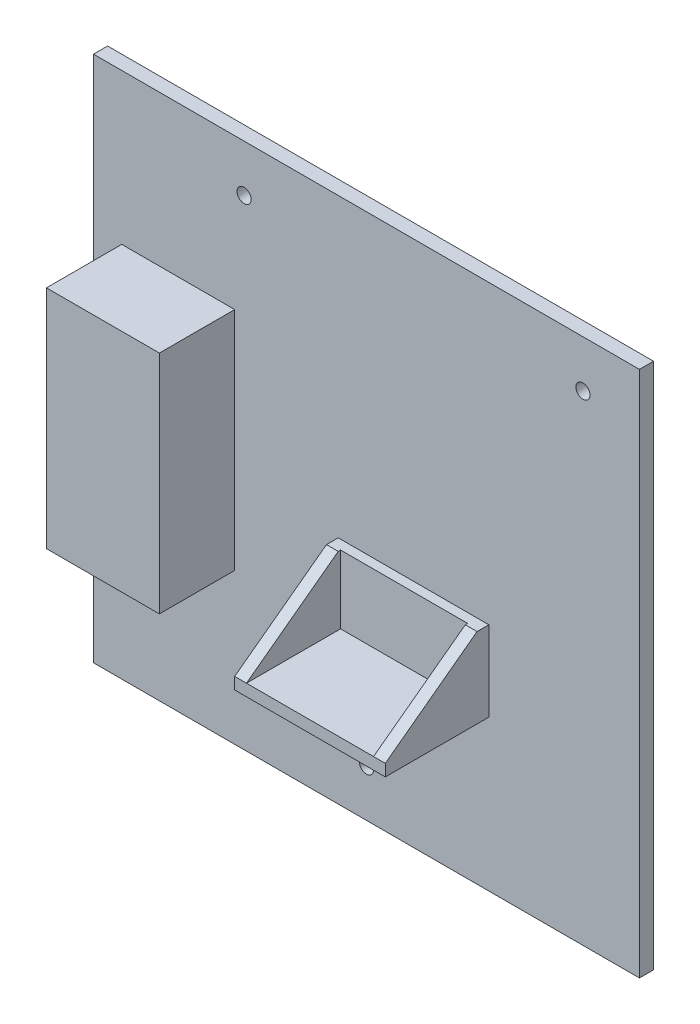
ISO-10303-21;
HEADER;
FILE_DESCRIPTION(('STEP AP214'),'2;1');
FILE_NAME('part.step','',(''),(''),'','','');
FILE_SCHEMA(('AUTOMOTIVE_DESIGN { 1 0 10303 214 1 1 1 1 }'));
ENDSEC;
DATA;
#1=APPLICATION_CONTEXT('core data for automotive mechanical design processes');
#2=APPLICATION_PROTOCOL_DEFINITION('international standard','automotive_design',2000,#1);
#3=PRODUCT_CONTEXT('',#1,'mechanical');
#4=PRODUCT('Part','Part','',(#3));
#5=PRODUCT_RELATED_PRODUCT_CATEGORY('part','',(#4));
#6=PRODUCT_DEFINITION_FORMATION('','',#4);
#7=PRODUCT_DEFINITION_CONTEXT('part definition',#1,'design');
#8=PRODUCT_DEFINITION('design','',#6,#7);
#9=PRODUCT_DEFINITION_SHAPE('','',#8);
#10=(LENGTH_UNIT() NAMED_UNIT(*) SI_UNIT(.MILLI.,.METRE.));
#11=(NAMED_UNIT(*) PLANE_ANGLE_UNIT() SI_UNIT($,.RADIAN.));
#12=(NAMED_UNIT(*) SI_UNIT($,.STERADIAN.) SOLID_ANGLE_UNIT());
#13=UNCERTAINTY_MEASURE_WITH_UNIT(LENGTH_MEASURE(1.E-05),#10,'distance_accuracy_value','');
#14=(GEOMETRIC_REPRESENTATION_CONTEXT(3) GLOBAL_UNCERTAINTY_ASSIGNED_CONTEXT((#13)) GLOBAL_UNIT_ASSIGNED_CONTEXT((#10,
#11,#12)) REPRESENTATION_CONTEXT('',''));
#15=CARTESIAN_POINT('',(0.,0.,0.));
#16=DIRECTION('',(0.,0.,1.));
#17=DIRECTION('',(1.,0.,0.));
#18=AXIS2_PLACEMENT_3D('',#15,#16,#17);
#19=CARTESIAN_POINT('',(-3.50000000000003,-24.,25.));
#20=DIRECTION('',(1.,0.,0.));
#21=DIRECTION('',(0.,0.,-1.));
#22=AXIS2_PLACEMENT_3D('',#19,#20,#21);
#23=PLANE('',#22);
#24=DIRECTION('',(0.,0.596702766344561,-0.802462340946133));
#25=VECTOR('',#24,1.);
#26=CARTESIAN_POINT('',(-3.50000000000003,-22.3901354784081,26.1970787468247));
#27=LINE('',#26,#25);
#28=CARTESIAN_POINT('',(-3.50000000000003,-21.5,25.));
#29=VERTEX_POINT('',#28);
#30=CARTESIAN_POINT('',(-3.50000000000003,-7.00000000000001,5.5));
#31=VERTEX_POINT('',#30);
#32=EDGE_CURVE('E60',#29,#31,#27,.T.);
#33=ORIENTED_EDGE('',*,*,#32,.F.);
#34=DIRECTION('',(0.,0.,-1.));
#35=VECTOR('',#34,1.);
#36=CARTESIAN_POINT('',(-3.50000000000003,-21.5,25.));
#37=LINE('',#36,#35);
#38=CARTESIAN_POINT('',(-3.50000000000003,-21.5,5.));
#39=VERTEX_POINT('',#38);
#40=EDGE_CURVE('E374',#29,#39,#37,.T.);
#41=ORIENTED_EDGE('',*,*,#40,.T.);
#42=DIRECTION('',(0.,-1.,0.));
#43=VECTOR('',#42,1.);
#44=CARTESIAN_POINT('',(-3.50000000000003,-7.00000000000001,5.));
#45=LINE('',#44,#43);
#46=CARTESIAN_POINT('',(-3.50000000000003,-7.00000000000001,5.));
#47=VERTEX_POINT('',#46);
#48=EDGE_CURVE('E362',#47,#39,#45,.T.);
#49=ORIENTED_EDGE('',*,*,#48,.F.);
#50=DIRECTION('',(0.,0.,-1.));
#51=VECTOR('',#50,1.);
#52=CARTESIAN_POINT('',(-3.50000000000003,-7.00000000000001,25.));
#53=LINE('',#52,#51);
#54=EDGE_CURVE('E391',#31,#47,#53,.T.);
#55=ORIENTED_EDGE('',*,*,#54,.F.);
#56=EDGE_LOOP('',(#33,#41,#49,#55));
#57=FACE_BOUND('',#56,.T.);
#58=ADVANCED_FACE('F35',(#57),#23,.T.);
#59=CARTESIAN_POINT('',(23.5,-7.00000000000001,25.));
#60=DIRECTION('',(-1.,0.,0.));
#61=DIRECTION('',(0.,0.,1.));
#62=AXIS2_PLACEMENT_3D('',#59,#60,#61);
#63=PLANE('',#62);
#64=DIRECTION('',(0.,-0.596702766344561,0.802462340946133));
#65=VECTOR('',#64,1.);
#66=CARTESIAN_POINT('',(23.5,-16.3372142252329,18.0569432684166));
#67=LINE('',#66,#65);
#68=CARTESIAN_POINT('',(23.5,-7.00000000000001,5.5));
#69=VERTEX_POINT('',#68);
#70=CARTESIAN_POINT('',(23.5,-21.5,25.));
#71=VERTEX_POINT('',#70);
#72=EDGE_CURVE('E180',#69,#71,#67,.T.);
#73=ORIENTED_EDGE('',*,*,#72,.F.);
#74=DIRECTION('',(0.,0.,-1.));
#75=VECTOR('',#74,1.);
#76=CARTESIAN_POINT('',(23.5,-7.00000000000001,25.));
#77=LINE('',#76,#75);
#78=CARTESIAN_POINT('',(23.5,-7.00000000000001,5.));
#79=VERTEX_POINT('',#78);
#80=EDGE_CURVE('E345',#69,#79,#77,.T.);
#81=ORIENTED_EDGE('',*,*,#80,.T.);
#82=DIRECTION('',(0.,-1.,0.));
#83=VECTOR('',#82,1.);
#84=CARTESIAN_POINT('',(23.5,-7.00000000000001,5.));
#85=LINE('',#84,#83);
#86=CARTESIAN_POINT('',(23.5,-21.5,5.));
#87=VERTEX_POINT('',#86);
#88=EDGE_CURVE('E359',#79,#87,#85,.T.);
#89=ORIENTED_EDGE('',*,*,#88,.T.);
#90=DIRECTION('',(0.,0.,-1.));
#91=VECTOR('',#90,1.);
#92=CARTESIAN_POINT('',(23.5,-21.5,25.));
#93=LINE('',#92,#91);
#94=EDGE_CURVE('E350',#71,#87,#93,.T.);
#95=ORIENTED_EDGE('',*,*,#94,.F.);
#96=EDGE_LOOP('',(#73,#81,#89,#95));
#97=FACE_BOUND('',#96,.T.);
#98=ADVANCED_FACE('F347',(#97),#63,.T.);
#99=CARTESIAN_POINT('',(-6.00000000000003,-21.5,25.));
#100=DIRECTION('',(0.,1.,0.));
#101=DIRECTION('',(0.,0.,1.));
#102=AXIS2_PLACEMENT_3D('',#99,#100,#101);
#103=PLANE('',#102);
#104=ORIENTED_EDGE('',*,*,#94,.T.);
#105=DIRECTION('',(1.,0.,0.));
#106=VECTOR('',#105,1.);
#107=CARTESIAN_POINT('',(23.5,-21.5,5.));
#108=LINE('',#107,#106);
#109=EDGE_CURVE('E353',#39,#87,#108,.T.);
#110=ORIENTED_EDGE('',*,*,#109,.F.);
#111=ORIENTED_EDGE('',*,*,#40,.F.);
#112=DIRECTION('',(1.,0.,0.));
#113=VECTOR('',#112,1.);
#114=CARTESIAN_POINT('',(0.,-21.5,25.));
#115=LINE('',#114,#113);
#116=EDGE_CURVE('E364',#29,#71,#115,.T.);
#117=ORIENTED_EDGE('',*,*,#116,.T.);
#118=EDGE_LOOP('',(#104,#110,#111,#117));
#119=FACE_BOUND('',#118,.T.);
#120=ADVANCED_FACE('F421',(#119),#103,.T.);
#121=CARTESIAN_POINT('',(0.,0.,25.));
#122=DIRECTION('',(0.,0.,-1.));
#123=DIRECTION('',(-1.,0.,0.));
#124=AXIS2_PLACEMENT_3D('',#121,#122,#123);
#125=PLANE('',#124);
#126=DIRECTION('',(0.,1.,0.));
#127=VECTOR('',#126,1.);
#128=CARTESIAN_POINT('',(26.,-7.00000000000001,25.));
#129=LINE('',#128,#127);
#130=CARTESIAN_POINT('',(26.,-24.,25.));
#131=VERTEX_POINT('',#130);
#132=CARTESIAN_POINT('',(26.,-21.5,25.));
#133=VERTEX_POINT('',#132);
#134=EDGE_CURVE('E192',#131,#133,#129,.T.);
#135=ORIENTED_EDGE('',*,*,#134,.T.);
#136=DIRECTION('',(1.,0.,0.));
#137=VECTOR('',#136,1.);
#138=CARTESIAN_POINT('',(-8.50000000000004,-21.5,25.));
#139=LINE('',#138,#137);
#140=EDGE_CURVE('E177',#71,#133,#139,.T.);
#141=ORIENTED_EDGE('',*,*,#140,.F.);
#142=ORIENTED_EDGE('',*,*,#116,.F.);
#143=CARTESIAN_POINT('',(-6.00000000000003,-21.5,25.));
#144=VERTEX_POINT('',#143);
#145=EDGE_CURVE('E185',#144,#29,#139,.T.);
#146=ORIENTED_EDGE('',*,*,#145,.F.);
#147=DIRECTION('',(0.,-1.,0.));
#148=VECTOR('',#147,1.);
#149=CARTESIAN_POINT('',(-6.00000000000003,-24.,25.));
#150=LINE('',#149,#148);
#151=CARTESIAN_POINT('',(-6.00000000000003,-24.,25.));
#152=VERTEX_POINT('',#151);
#153=EDGE_CURVE('E203',#144,#152,#150,.T.);
#154=ORIENTED_EDGE('',*,*,#153,.T.);
#155=DIRECTION('',(1.,0.,0.));
#156=VECTOR('',#155,1.);
#157=CARTESIAN_POINT('',(-6.00000000000003,-24.,25.));
#158=LINE('',#157,#156);
#159=EDGE_CURVE('E198',#152,#131,#158,.T.);
#160=ORIENTED_EDGE('',*,*,#159,.T.);
#161=EDGE_LOOP('',(#135,#141,#142,#146,#154,#160));
#162=FACE_BOUND('',#161,.T.);
#163=ADVANCED_FACE('F196',(#162),#125,.F.);
#164=CARTESIAN_POINT('',(0.,0.,3.));
#165=DIRECTION('',(0.,0.,-1.));
#166=DIRECTION('',(-1.,0.,0.));
#167=AXIS2_PLACEMENT_3D('',#164,#165,#166);
#168=PLANE('',#167);
#169=CARTESIAN_POINT('',(-26.,46.,3.));
#170=DIRECTION('',(0.,0.,1.));
#171=DIRECTION('',(1.,0.,0.));
#172=AXIS2_PLACEMENT_3D('',#169,#170,#171);
#173=CIRCLE('',#172,1.5);
#174=CARTESIAN_POINT('',(-24.5,46.,3.));
#175=VERTEX_POINT('',#174);
#176=EDGE_CURVE('E291',#175,#175,#173,.T.);
#177=ORIENTED_EDGE('',*,*,#176,.F.);
#178=EDGE_LOOP('',(#177));
#179=FACE_BOUND('',#178,.T.);
#180=CARTESIAN_POINT('',(46.,46.,3.));
#181=DIRECTION('',(0.,0.,1.));
#182=DIRECTION('',(1.,0.,0.));
#183=AXIS2_PLACEMENT_3D('',#180,#181,#182);
#184=CIRCLE('',#183,1.5);
#185=CARTESIAN_POINT('',(47.5,46.,3.));
#186=VERTEX_POINT('',#185);
#187=EDGE_CURVE('E667',#186,#186,#184,.T.);
#188=ORIENTED_EDGE('',*,*,#187,.F.);
#189=EDGE_LOOP('',(#188));
#190=FACE_BOUND('',#189,.T.);
#191=CARTESIAN_POINT('',(0.,-46.,3.));
#192=DIRECTION('',(0.,0.,1.));
#193=DIRECTION('',(1.,0.,0.));
#194=AXIS2_PLACEMENT_3D('',#191,#192,#193);
#195=CIRCLE('',#194,1.5);
#196=CARTESIAN_POINT('',(1.49999999999997,-46.,3.));
#197=VERTEX_POINT('',#196);
#198=EDGE_CURVE('E669',#197,#197,#195,.T.);
#199=ORIENTED_EDGE('',*,*,#198,.F.);
#200=EDGE_LOOP('',(#199));
#201=FACE_BOUND('',#200,.T.);
#202=DIRECTION('',(0.,1.,0.));
#203=VECTOR('',#202,1.);
#204=CARTESIAN_POINT('',(-28.,-24.,3.));
#205=LINE('',#204,#203);
#206=CARTESIAN_POINT('',(-28.,-24.,3.));
#207=VERTEX_POINT('',#206);
#208=CARTESIAN_POINT('',(-28.,24.,3.));
#209=VERTEX_POINT('',#208);
#210=EDGE_CURVE('E225',#207,#209,#205,.T.);
#211=ORIENTED_EDGE('',*,*,#210,.F.);
#212=DIRECTION('',(1.,0.,0.));
#213=VECTOR('',#212,1.);
#214=CARTESIAN_POINT('',(-52.,-24.,3.));
#215=LINE('',#214,#213);
#216=CARTESIAN_POINT('',(-52.,-24.,3.));
#217=VERTEX_POINT('',#216);
#218=EDGE_CURVE('E230',#217,#207,#215,.T.);
#219=ORIENTED_EDGE('',*,*,#218,.F.);
#220=DIRECTION('',(0.,-1.,0.));
#221=VECTOR('',#220,1.);
#222=CARTESIAN_POINT('',(-52.,-24.,3.));
#223=LINE('',#222,#221);
#224=CARTESIAN_POINT('',(-52.,24.,3.));
#225=VERTEX_POINT('',#224);
#226=EDGE_CURVE('E242',#225,#217,#223,.T.);
#227=ORIENTED_EDGE('',*,*,#226,.F.);
#228=DIRECTION('',(-1.,0.,0.));
#229=VECTOR('',#228,1.);
#230=CARTESIAN_POINT('',(-52.,24.,3.));
#231=LINE('',#230,#229);
#232=EDGE_CURVE('E239',#209,#225,#231,.T.);
#233=ORIENTED_EDGE('',*,*,#232,.F.);
#234=EDGE_LOOP('',(#211,#219,#227,#233));
#235=FACE_BOUND('',#234,.T.);
#236=DIRECTION('',(0.,1.,0.));
#237=VECTOR('',#236,1.);
#238=CARTESIAN_POINT('',(58.,-56.,3.));
#239=LINE('',#238,#237);
#240=CARTESIAN_POINT('',(58.,-56.,3.));
#241=VERTEX_POINT('',#240);
#242=CARTESIAN_POINT('',(58.,56.,3.));
#243=VERTEX_POINT('',#242);
#244=EDGE_CURVE('E259',#241,#243,#239,.T.);
#245=ORIENTED_EDGE('',*,*,#244,.T.);
#246=DIRECTION('',(-1.,0.,0.));
#247=VECTOR('',#246,1.);
#248=CARTESIAN_POINT('',(-58.,56.,3.));
#249=LINE('',#248,#247);
#250=CARTESIAN_POINT('',(-58.,56.,3.));
#251=VERTEX_POINT('',#250);
#252=EDGE_CURVE('E262',#243,#251,#249,.T.);
#253=ORIENTED_EDGE('',*,*,#252,.T.);
#254=DIRECTION('',(0.,-1.,0.));
#255=VECTOR('',#254,1.);
#256=CARTESIAN_POINT('',(-58.,-56.,3.));
#257=LINE('',#256,#255);
#258=CARTESIAN_POINT('',(-58.,-56.,3.));
#259=VERTEX_POINT('',#258);
#260=EDGE_CURVE('E265',#251,#259,#257,.T.);
#261=ORIENTED_EDGE('',*,*,#260,.T.);
#262=DIRECTION('',(1.,0.,0.));
#263=VECTOR('',#262,1.);
#264=CARTESIAN_POINT('',(-58.,-56.,3.));
#265=LINE('',#264,#263);
#266=EDGE_CURVE('E267',#259,#241,#265,.T.);
#267=ORIENTED_EDGE('',*,*,#266,.T.);
#268=EDGE_LOOP('',(#245,#253,#261,#267));
#269=FACE_BOUND('',#268,.T.);
#270=DIRECTION('',(0.,-1.,0.));
#271=VECTOR('',#270,1.);
#272=CARTESIAN_POINT('',(-6.00000000000003,-24.,3.));
#273=LINE('',#272,#271);
#274=CARTESIAN_POINT('',(-6.00000000000003,-7.00000000000001,3.));
#275=VERTEX_POINT('',#274);
#276=CARTESIAN_POINT('',(-6.00000000000003,-24.,3.));
#277=VERTEX_POINT('',#276);
#278=EDGE_CURVE('E207',#275,#277,#273,.T.);
#279=ORIENTED_EDGE('',*,*,#278,.F.);
#280=DIRECTION('',(-1.,0.,0.));
#281=VECTOR('',#280,1.);
#282=CARTESIAN_POINT('',(-6.00000000000003,-7.00000000000001,3.));
#283=LINE('',#282,#281);
#284=CARTESIAN_POINT('',(26.,-7.00000000000001,3.));
#285=VERTEX_POINT('',#284);
#286=EDGE_CURVE('E216',#285,#275,#283,.T.);
#287=ORIENTED_EDGE('',*,*,#286,.F.);
#288=DIRECTION('',(0.,1.,0.));
#289=VECTOR('',#288,1.);
#290=CARTESIAN_POINT('',(26.,-7.00000000000001,3.));
#291=LINE('',#290,#289);
#292=CARTESIAN_POINT('',(26.,-24.,3.));
#293=VERTEX_POINT('',#292);
#294=EDGE_CURVE('E214',#293,#285,#291,.T.);
#295=ORIENTED_EDGE('',*,*,#294,.F.);
#296=DIRECTION('',(1.,0.,0.));
#297=VECTOR('',#296,1.);
#298=CARTESIAN_POINT('',(-6.00000000000003,-24.,3.));
#299=LINE('',#298,#297);
#300=EDGE_CURVE('E210',#277,#293,#299,.T.);
#301=ORIENTED_EDGE('',*,*,#300,.F.);
#302=EDGE_LOOP('',(#279,#287,#295,#301));
#303=FACE_BOUND('',#302,.T.);
#304=ADVANCED_FACE('F327',(#179,#190,#201,#235,#269,#303),#168,.F.);
#305=CARTESIAN_POINT('',(58.,-56.,3.));
#306=DIRECTION('',(-1.,0.,0.));
#307=DIRECTION('',(0.,0.,1.));
#308=AXIS2_PLACEMENT_3D('',#305,#306,#307);
#309=PLANE('',#308);
#310=DIRECTION('',(0.,1.,0.));
#311=VECTOR('',#310,1.);
#312=CARTESIAN_POINT('',(58.,-56.,0.));
#313=LINE('',#312,#311);
#314=CARTESIAN_POINT('',(58.,-56.,0.));
#315=VERTEX_POINT('',#314);
#316=CARTESIAN_POINT('',(58.,56.,0.));
#317=VERTEX_POINT('',#316);
#318=EDGE_CURVE('E258',#315,#317,#313,.T.);
#319=ORIENTED_EDGE('',*,*,#318,.T.);
#320=DIRECTION('',(0.,0.,-1.));
#321=VECTOR('',#320,1.);
#322=CARTESIAN_POINT('',(58.,56.,3.));
#323=LINE('',#322,#321);
#324=EDGE_CURVE('E285',#243,#317,#323,.T.);
#325=ORIENTED_EDGE('',*,*,#324,.F.);
#326=ORIENTED_EDGE('',*,*,#244,.F.);
#327=DIRECTION('',(0.,0.,-1.));
#328=VECTOR('',#327,1.);
#329=CARTESIAN_POINT('',(58.,-56.,3.));
#330=LINE('',#329,#328);
#331=EDGE_CURVE('E269',#241,#315,#330,.T.);
#332=ORIENTED_EDGE('',*,*,#331,.T.);
#333=EDGE_LOOP('',(#319,#325,#326,#332));
#334=FACE_BOUND('',#333,.T.);
#335=ADVANCED_FACE('F37',(#334),#309,.F.);
#336=CARTESIAN_POINT('',(-58.,56.,3.));
#337=DIRECTION('',(0.,-1.,0.));
#338=DIRECTION('',(0.,0.,-1.));
#339=AXIS2_PLACEMENT_3D('',#336,#337,#338);
#340=PLANE('',#339);
#341=DIRECTION('',(-1.,0.,0.));
#342=VECTOR('',#341,1.);
#343=CARTESIAN_POINT('',(-58.,56.,0.));
#344=LINE('',#343,#342);
#345=CARTESIAN_POINT('',(-58.,56.,0.));
#346=VERTEX_POINT('',#345);
#347=EDGE_CURVE('E272',#317,#346,#344,.T.);
#348=ORIENTED_EDGE('',*,*,#347,.T.);
#349=DIRECTION('',(0.,0.,-1.));
#350=VECTOR('',#349,1.);
#351=CARTESIAN_POINT('',(-58.,56.,3.));
#352=LINE('',#351,#350);
#353=EDGE_CURVE('E282',#251,#346,#352,.T.);
#354=ORIENTED_EDGE('',*,*,#353,.F.);
#355=ORIENTED_EDGE('',*,*,#252,.F.);
#356=ORIENTED_EDGE('',*,*,#324,.T.);
#357=EDGE_LOOP('',(#348,#354,#355,#356));
#358=FACE_BOUND('',#357,.T.);
#359=ADVANCED_FACE('F325',(#358),#340,.F.);
#360=CARTESIAN_POINT('',(-58.,-56.,3.));
#361=DIRECTION('',(1.,0.,0.));
#362=DIRECTION('',(0.,0.,-1.));
#363=AXIS2_PLACEMENT_3D('',#360,#361,#362);
#364=PLANE('',#363);
#365=DIRECTION('',(0.,-1.,0.));
#366=VECTOR('',#365,1.);
#367=CARTESIAN_POINT('',(-58.,-56.,0.));
#368=LINE('',#367,#366);
#369=CARTESIAN_POINT('',(-58.,-56.,0.));
#370=VERTEX_POINT('',#369);
#371=EDGE_CURVE('E274',#346,#370,#368,.T.);
#372=ORIENTED_EDGE('',*,*,#371,.T.);
#373=DIRECTION('',(0.,0.,-1.));
#374=VECTOR('',#373,1.);
#375=CARTESIAN_POINT('',(-58.,-56.,3.));
#376=LINE('',#375,#374);
#377=EDGE_CURVE('E279',#259,#370,#376,.T.);
#378=ORIENTED_EDGE('',*,*,#377,.F.);
#379=ORIENTED_EDGE('',*,*,#260,.F.);
#380=ORIENTED_EDGE('',*,*,#353,.T.);
#381=EDGE_LOOP('',(#372,#378,#379,#380));
#382=FACE_BOUND('',#381,.T.);
#383=ADVANCED_FACE('F322',(#382),#364,.F.);
#384=CARTESIAN_POINT('',(-58.,-56.,3.));
#385=DIRECTION('',(0.,1.,0.));
#386=DIRECTION('',(0.,0.,1.));
#387=AXIS2_PLACEMENT_3D('',#384,#385,#386);
#388=PLANE('',#387);
#389=DIRECTION('',(1.,0.,0.));
#390=VECTOR('',#389,1.);
#391=CARTESIAN_POINT('',(-58.,-56.,0.));
#392=LINE('',#391,#390);
#393=EDGE_CURVE('E263',#370,#315,#392,.T.);
#394=ORIENTED_EDGE('',*,*,#393,.T.);
#395=ORIENTED_EDGE('',*,*,#331,.F.);
#396=ORIENTED_EDGE('',*,*,#266,.F.);
#397=ORIENTED_EDGE('',*,*,#377,.T.);
#398=EDGE_LOOP('',(#394,#395,#396,#397));
#399=FACE_BOUND('',#398,.T.);
#400=ADVANCED_FACE('F305',(#399),#388,.F.);
#401=CARTESIAN_POINT('',(0.,0.,0.));
#402=DIRECTION('',(0.,0.,-1.));
#403=DIRECTION('',(-1.,0.,0.));
#404=AXIS2_PLACEMENT_3D('',#401,#402,#403);
#405=PLANE('',#404);
#406=CARTESIAN_POINT('',(-26.,46.,0.));
#407=DIRECTION('',(0.,0.,-1.));
#408=DIRECTION('',(-1.,0.,0.));
#409=AXIS2_PLACEMENT_3D('',#406,#407,#408);
#410=CIRCLE('',#409,1.5);
#411=CARTESIAN_POINT('',(-27.5,46.,0.));
#412=VERTEX_POINT('',#411);
#413=EDGE_CURVE('E39',#412,#412,#410,.T.);
#414=ORIENTED_EDGE('',*,*,#413,.F.);
#415=EDGE_LOOP('',(#414));
#416=FACE_BOUND('',#415,.T.);
#417=CARTESIAN_POINT('',(46.,46.,0.));
#418=DIRECTION('',(0.,0.,-1.));
#419=DIRECTION('',(-1.,0.,0.));
#420=AXIS2_PLACEMENT_3D('',#417,#418,#419);
#421=CIRCLE('',#420,1.5);
#422=CARTESIAN_POINT('',(44.5,46.,0.));
#423=VERTEX_POINT('',#422);
#424=EDGE_CURVE('E290',#423,#423,#421,.T.);
#425=ORIENTED_EDGE('',*,*,#424,.F.);
#426=EDGE_LOOP('',(#425));
#427=FACE_BOUND('',#426,.T.);
#428=CARTESIAN_POINT('',(0.,-46.,0.));
#429=DIRECTION('',(0.,0.,-1.));
#430=DIRECTION('',(-1.,0.,0.));
#431=AXIS2_PLACEMENT_3D('',#428,#429,#430);
#432=CIRCLE('',#431,1.5);
#433=CARTESIAN_POINT('',(-1.50000000000003,-46.,0.));
#434=VERTEX_POINT('',#433);
#435=EDGE_CURVE('E288',#434,#434,#432,.T.);
#436=ORIENTED_EDGE('',*,*,#435,.F.);
#437=EDGE_LOOP('',(#436));
#438=FACE_BOUND('',#437,.T.);
#439=ORIENTED_EDGE('',*,*,#318,.F.);
#440=ORIENTED_EDGE('',*,*,#393,.F.);
#441=ORIENTED_EDGE('',*,*,#371,.F.);
#442=ORIENTED_EDGE('',*,*,#347,.F.);
#443=EDGE_LOOP('',(#439,#440,#441,#442));
#444=FACE_BOUND('',#443,.T.);
#445=ADVANCED_FACE('F301',(#416,#427,#438,#444),#405,.T.);
#446=CARTESIAN_POINT('',(-28.,-24.,19.));
#447=DIRECTION('',(-1.,0.,0.));
#448=DIRECTION('',(0.,0.,1.));
#449=AXIS2_PLACEMENT_3D('',#446,#447,#448);
#450=PLANE('',#449);
#451=ORIENTED_EDGE('',*,*,#210,.T.);
#452=DIRECTION('',(0.,0.,-1.));
#453=VECTOR('',#452,1.);
#454=CARTESIAN_POINT('',(-28.,24.,19.));
#455=LINE('',#454,#453);
#456=CARTESIAN_POINT('',(-28.,24.,19.));
#457=VERTEX_POINT('',#456);
#458=EDGE_CURVE('E255',#457,#209,#455,.T.);
#459=ORIENTED_EDGE('',*,*,#458,.F.);
#460=DIRECTION('',(0.,1.,0.));
#461=VECTOR('',#460,1.);
#462=CARTESIAN_POINT('',(-28.,-24.,19.));
#463=LINE('',#462,#461);
#464=CARTESIAN_POINT('',(-28.,-24.,19.));
#465=VERTEX_POINT('',#464);
#466=EDGE_CURVE('E226',#465,#457,#463,.T.);
#467=ORIENTED_EDGE('',*,*,#466,.F.);
#468=DIRECTION('',(0.,0.,-1.));
#469=VECTOR('',#468,1.);
#470=CARTESIAN_POINT('',(-28.,-24.,19.));
#471=LINE('',#470,#469);
#472=EDGE_CURVE('E236',#465,#207,#471,.T.);
#473=ORIENTED_EDGE('',*,*,#472,.T.);
#474=EDGE_LOOP('',(#451,#459,#467,#473));
#475=FACE_BOUND('',#474,.T.);
#476=ADVANCED_FACE('F304',(#475),#450,.F.);
#477=CARTESIAN_POINT('',(-52.,24.,19.));
#478=DIRECTION('',(0.,-1.,0.));
#479=DIRECTION('',(0.,0.,-1.));
#480=AXIS2_PLACEMENT_3D('',#477,#478,#479);
#481=PLANE('',#480);
#482=ORIENTED_EDGE('',*,*,#232,.T.);
#483=DIRECTION('',(0.,0.,-1.));
#484=VECTOR('',#483,1.);
#485=CARTESIAN_POINT('',(-52.,24.,19.));
#486=LINE('',#485,#484);
#487=CARTESIAN_POINT('',(-52.,24.,19.));
#488=VERTEX_POINT('',#487);
#489=EDGE_CURVE('E252',#488,#225,#486,.T.);
#490=ORIENTED_EDGE('',*,*,#489,.F.);
#491=DIRECTION('',(-1.,0.,0.));
#492=VECTOR('',#491,1.);
#493=CARTESIAN_POINT('',(-52.,24.,19.));
#494=LINE('',#493,#492);
#495=EDGE_CURVE('E229',#457,#488,#494,.T.);
#496=ORIENTED_EDGE('',*,*,#495,.F.);
#497=ORIENTED_EDGE('',*,*,#458,.T.);
#498=EDGE_LOOP('',(#482,#490,#496,#497));
#499=FACE_BOUND('',#498,.T.);
#500=ADVANCED_FACE('F541',(#499),#481,.F.);
#501=CARTESIAN_POINT('',(-52.,-24.,19.));
#502=DIRECTION('',(1.,0.,0.));
#503=DIRECTION('',(0.,0.,-1.));
#504=AXIS2_PLACEMENT_3D('',#501,#502,#503);
#505=PLANE('',#504);
#506=ORIENTED_EDGE('',*,*,#226,.T.);
#507=DIRECTION('',(0.,0.,-1.));
#508=VECTOR('',#507,1.);
#509=CARTESIAN_POINT('',(-52.,-24.,19.));
#510=LINE('',#509,#508);
#511=CARTESIAN_POINT('',(-52.,-24.,19.));
#512=VERTEX_POINT('',#511);
#513=EDGE_CURVE('E249',#512,#217,#510,.T.);
#514=ORIENTED_EDGE('',*,*,#513,.F.);
#515=DIRECTION('',(0.,-1.,0.));
#516=VECTOR('',#515,1.);
#517=CARTESIAN_POINT('',(-52.,-24.,19.));
#518=LINE('',#517,#516);
#519=EDGE_CURVE('E232',#488,#512,#518,.T.);
#520=ORIENTED_EDGE('',*,*,#519,.F.);
#521=ORIENTED_EDGE('',*,*,#489,.T.);
#522=EDGE_LOOP('',(#506,#514,#520,#521));
#523=FACE_BOUND('',#522,.T.);
#524=ADVANCED_FACE('F531',(#523),#505,.F.);
#525=CARTESIAN_POINT('',(-52.,-24.,19.));
#526=DIRECTION('',(0.,1.,0.));
#527=DIRECTION('',(0.,0.,1.));
#528=AXIS2_PLACEMENT_3D('',#525,#526,#527);
#529=PLANE('',#528);
#530=ORIENTED_EDGE('',*,*,#218,.T.);
#531=ORIENTED_EDGE('',*,*,#472,.F.);
#532=DIRECTION('',(1.,0.,0.));
#533=VECTOR('',#532,1.);
#534=CARTESIAN_POINT('',(-52.,-24.,19.));
#535=LINE('',#534,#533);
#536=EDGE_CURVE('E234',#512,#465,#535,.T.);
#537=ORIENTED_EDGE('',*,*,#536,.F.);
#538=ORIENTED_EDGE('',*,*,#513,.T.);
#539=EDGE_LOOP('',(#530,#531,#537,#538));
#540=FACE_BOUND('',#539,.T.);
#541=ADVANCED_FACE('F520',(#540),#529,.F.);
#542=CARTESIAN_POINT('',(0.,0.,19.));
#543=DIRECTION('',(0.,0.,-1.));
#544=DIRECTION('',(-1.,0.,0.));
#545=AXIS2_PLACEMENT_3D('',#542,#543,#544);
#546=PLANE('',#545);
#547=ORIENTED_EDGE('',*,*,#466,.T.);
#548=ORIENTED_EDGE('',*,*,#495,.T.);
#549=ORIENTED_EDGE('',*,*,#519,.T.);
#550=ORIENTED_EDGE('',*,*,#536,.T.);
#551=EDGE_LOOP('',(#547,#548,#549,#550));
#552=FACE_BOUND('',#551,.T.);
#553=ADVANCED_FACE('F413',(#552),#546,.F.);
#554=CARTESIAN_POINT('',(-6.00000000000003,-24.,25.));
#555=DIRECTION('',(1.,0.,0.));
#556=DIRECTION('',(0.,0.,-1.));
#557=AXIS2_PLACEMENT_3D('',#554,#555,#556);
#558=PLANE('',#557);
#559=ORIENTED_EDGE('',*,*,#153,.F.);
#560=DIRECTION('',(0.,0.596702766344561,-0.802462340946133));
#561=VECTOR('',#560,1.);
#562=CARTESIAN_POINT('',(-6.00000000000003,-22.3901354784081,26.1970787468247));
#563=LINE('',#562,#561);
#564=CARTESIAN_POINT('',(-6.00000000000003,-7.00000000000001,5.5));
#565=VERTEX_POINT('',#564);
#566=EDGE_CURVE('E340',#144,#565,#563,.T.);
#567=ORIENTED_EDGE('',*,*,#566,.T.);
#568=DIRECTION('',(0.,0.,-1.));
#569=VECTOR('',#568,1.);
#570=CARTESIAN_POINT('',(-6.00000000000003,-7.00000000000001,25.));
#571=LINE('',#570,#569);
#572=EDGE_CURVE('E200',#565,#275,#571,.T.);
#573=ORIENTED_EDGE('',*,*,#572,.T.);
#574=ORIENTED_EDGE('',*,*,#278,.T.);
#575=DIRECTION('',(0.,0.,-1.));
#576=VECTOR('',#575,1.);
#577=CARTESIAN_POINT('',(-6.00000000000003,-24.,25.));
#578=LINE('',#577,#576);
#579=EDGE_CURVE('E222',#152,#277,#578,.T.);
#580=ORIENTED_EDGE('',*,*,#579,.F.);
#581=EDGE_LOOP('',(#559,#567,#573,#574,#580));
#582=FACE_BOUND('',#581,.T.);
#583=ADVANCED_FACE('F337',(#582),#558,.F.);
#584=CARTESIAN_POINT('',(-6.00000000000003,-24.,25.));
#585=DIRECTION('',(0.,1.,0.));
#586=DIRECTION('',(0.,0.,1.));
#587=AXIS2_PLACEMENT_3D('',#584,#585,#586);
#588=PLANE('',#587);
#589=ORIENTED_EDGE('',*,*,#300,.T.);
#590=DIRECTION('',(0.,0.,-1.));
#591=VECTOR('',#590,1.);
#592=CARTESIAN_POINT('',(26.,-24.,25.));
#593=LINE('',#592,#591);
#594=EDGE_CURVE('E220',#131,#293,#593,.T.);
#595=ORIENTED_EDGE('',*,*,#594,.F.);
#596=ORIENTED_EDGE('',*,*,#159,.F.);
#597=ORIENTED_EDGE('',*,*,#579,.T.);
#598=EDGE_LOOP('',(#589,#595,#596,#597));
#599=FACE_BOUND('',#598,.T.);
#600=ADVANCED_FACE('F405',(#599),#588,.F.);
#601=CARTESIAN_POINT('',(26.,-7.00000000000001,25.));
#602=DIRECTION('',(-1.,0.,0.));
#603=DIRECTION('',(0.,0.,1.));
#604=AXIS2_PLACEMENT_3D('',#601,#602,#603);
#605=PLANE('',#604);
#606=DIRECTION('',(0.,0.,-1.));
#607=VECTOR('',#606,1.);
#608=CARTESIAN_POINT('',(26.,-7.00000000000001,25.));
#609=LINE('',#608,#607);
#610=CARTESIAN_POINT('',(26.,-7.00000000000001,5.5));
#611=VERTEX_POINT('',#610);
#612=EDGE_CURVE('E194',#611,#285,#609,.T.);
#613=ORIENTED_EDGE('',*,*,#612,.F.);
#614=DIRECTION('',(0.,0.596702766344561,-0.802462340946133));
#615=VECTOR('',#614,1.);
#616=CARTESIAN_POINT('',(26.,-1.87404741744285,-1.39352243861135));
#617=LINE('',#616,#615);
#618=EDGE_CURVE('E52',#133,#611,#617,.T.);
#619=ORIENTED_EDGE('',*,*,#618,.F.);
#620=ORIENTED_EDGE('',*,*,#134,.F.);
#621=ORIENTED_EDGE('',*,*,#594,.T.);
#622=ORIENTED_EDGE('',*,*,#294,.T.);
#623=EDGE_LOOP('',(#613,#619,#620,#621,#622));
#624=FACE_BOUND('',#623,.T.);
#625=ADVANCED_FACE('F190',(#624),#605,.F.);
#626=CARTESIAN_POINT('',(-6.00000000000003,-7.00000000000001,25.));
#627=DIRECTION('',(0.,-1.,0.));
#628=DIRECTION('',(0.,0.,-1.));
#629=AXIS2_PLACEMENT_3D('',#626,#627,#628);
#630=PLANE('',#629);
#631=ORIENTED_EDGE('',*,*,#572,.F.);
#632=DIRECTION('',(1.,0.,0.));
#633=VECTOR('',#632,1.);
#634=CARTESIAN_POINT('',(-6.00000000000003,-7.00000000000001,5.5));
#635=LINE('',#634,#633);
#636=EDGE_CURVE('E11',#565,#31,#635,.T.);
#637=ORIENTED_EDGE('',*,*,#636,.T.);
#638=ORIENTED_EDGE('',*,*,#54,.T.);
#639=DIRECTION('',(1.,0.,0.));
#640=VECTOR('',#639,1.);
#641=CARTESIAN_POINT('',(23.5,-7.00000000000001,5.));
#642=LINE('',#641,#640);
#643=EDGE_CURVE('E357',#47,#79,#642,.T.);
#644=ORIENTED_EDGE('',*,*,#643,.T.);
#645=ORIENTED_EDGE('',*,*,#80,.F.);
#646=EDGE_CURVE('E44',#69,#611,#635,.T.);
#647=ORIENTED_EDGE('',*,*,#646,.T.);
#648=ORIENTED_EDGE('',*,*,#612,.T.);
#649=ORIENTED_EDGE('',*,*,#286,.T.);
#650=EDGE_LOOP('',(#631,#637,#638,#644,#645,#647,#648,#649));
#651=FACE_BOUND('',#650,.T.);
#652=ADVANCED_FACE('F342',(#651),#630,.F.);
#653=CARTESIAN_POINT('',(23.5,-7.00000000000001,5.));
#654=DIRECTION('',(0.,0.,-1.));
#655=DIRECTION('',(-1.,0.,0.));
#656=AXIS2_PLACEMENT_3D('',#653,#654,#655);
#657=PLANE('',#656);
#658=ORIENTED_EDGE('',*,*,#109,.T.);
#659=ORIENTED_EDGE('',*,*,#88,.F.);
#660=ORIENTED_EDGE('',*,*,#643,.F.);
#661=ORIENTED_EDGE('',*,*,#48,.T.);
#662=EDGE_LOOP('',(#658,#659,#660,#661));
#663=FACE_BOUND('',#662,.T.);
#664=ADVANCED_FACE('F433',(#663),#657,.F.);
#665=CARTESIAN_POINT('',(-8.50000000000004,-1.87404741744285,-1.39352243861135));
#666=DIRECTION('',(0.,-0.802462340946133,-0.596702766344561));
#667=DIRECTION('',(0.,0.596702766344561,-0.802462340946133));
#668=AXIS2_PLACEMENT_3D('',#665,#666,#667);
#669=PLANE('',#668);
#670=ORIENTED_EDGE('',*,*,#72,.T.);
#671=ORIENTED_EDGE('',*,*,#140,.T.);
#672=ORIENTED_EDGE('',*,*,#618,.T.);
#673=ORIENTED_EDGE('',*,*,#646,.F.);
#674=EDGE_LOOP('',(#670,#671,#672,#673));
#675=FACE_BOUND('',#674,.T.);
#676=ADVANCED_FACE('F178',(#675),#669,.F.);
#677=ORIENTED_EDGE('',*,*,#32,.T.);
#678=ORIENTED_EDGE('',*,*,#636,.F.);
#679=ORIENTED_EDGE('',*,*,#566,.F.);
#680=ORIENTED_EDGE('',*,*,#145,.T.);
#681=EDGE_LOOP('',(#677,#678,#679,#680));
#682=FACE_BOUND('',#681,.T.);
#683=ADVANCED_FACE('F442',(#682),#669,.F.);
#684=CARTESIAN_POINT('',(0.,-46.,-31.5));
#685=DIRECTION('',(0.,0.,1.));
#686=DIRECTION('',(1.,0.,0.));
#687=AXIS2_PLACEMENT_3D('',#684,#685,#686);
#688=CYLINDRICAL_SURFACE('',#687,1.5);
#689=ORIENTED_EDGE('',*,*,#435,.T.);
#690=EDGE_LOOP('',(#689));
#691=FACE_BOUND('',#690,.T.);
#692=ORIENTED_EDGE('',*,*,#198,.T.);
#693=EDGE_LOOP('',(#692));
#694=FACE_BOUND('',#693,.T.);
#695=ADVANCED_FACE('F637',(#691,#694),#688,.F.);
#696=CARTESIAN_POINT('',(46.,46.,-31.5));
#697=DIRECTION('',(0.,0.,1.));
#698=DIRECTION('',(1.,0.,0.));
#699=AXIS2_PLACEMENT_3D('',#696,#697,#698);
#700=CYLINDRICAL_SURFACE('',#699,1.5);
#701=ORIENTED_EDGE('',*,*,#424,.T.);
#702=EDGE_LOOP('',(#701));
#703=FACE_BOUND('',#702,.T.);
#704=ORIENTED_EDGE('',*,*,#187,.T.);
#705=EDGE_LOOP('',(#704));
#706=FACE_BOUND('',#705,.T.);
#707=ADVANCED_FACE('F644',(#703,#706),#700,.F.);
#708=CARTESIAN_POINT('',(-26.,46.,-31.5));
#709=DIRECTION('',(0.,0.,1.));
#710=DIRECTION('',(1.,0.,0.));
#711=AXIS2_PLACEMENT_3D('',#708,#709,#710);
#712=CYLINDRICAL_SURFACE('',#711,1.5);
#713=ORIENTED_EDGE('',*,*,#413,.T.);
#714=EDGE_LOOP('',(#713));
#715=FACE_BOUND('',#714,.T.);
#716=ORIENTED_EDGE('',*,*,#176,.T.);
#717=EDGE_LOOP('',(#716));
#718=FACE_BOUND('',#717,.T.);
#719=ADVANCED_FACE('F298',(#715,#718),#712,.F.);
#720=CLOSED_SHELL('',(#58,#98,#120,#163,#304,#335,#359,#383,#400,#445,#476,#500,#524,#541,#553,
#583,#600,#625,#652,#664,#676,#683,#695,#707,#719));
#721=CARTESIAN_POINT('',(-52.,21.5,19.));
#722=DIRECTION('',(0.,-1.,0.));
#723=DIRECTION('',(0.,0.,-1.));
#724=AXIS2_PLACEMENT_3D('',#721,#722,#723);
#725=PLANE('',#724);
#726=DIRECTION('',(0.,0.,-1.));
#727=VECTOR('',#726,1.);
#728=CARTESIAN_POINT('',(-30.5,21.5,19.));
#729=LINE('',#728,#727);
#730=CARTESIAN_POINT('',(-30.5,21.5,16.5));
#731=VERTEX_POINT('',#730);
#732=CARTESIAN_POINT('',(-30.5,21.5,2.5));
#733=VERTEX_POINT('',#732);
#734=EDGE_CURVE('E365',#731,#733,#729,.T.);
#735=ORIENTED_EDGE('',*,*,#734,.F.);
#736=DIRECTION('',(-1.,0.,0.));
#737=VECTOR('',#736,1.);
#738=CARTESIAN_POINT('',(0.,21.5,16.5));
#739=LINE('',#738,#737);
#740=CARTESIAN_POINT('',(-49.5,21.5,16.5));
#741=VERTEX_POINT('',#740);
#742=EDGE_CURVE('E373',#731,#741,#739,.T.);
#743=ORIENTED_EDGE('',*,*,#742,.T.);
#744=DIRECTION('',(0.,0.,-1.));
#745=VECTOR('',#744,1.);
#746=CARTESIAN_POINT('',(-49.5,21.5,19.));
#747=LINE('',#746,#745);
#748=CARTESIAN_POINT('',(-49.5,21.5,2.5));
#749=VERTEX_POINT('',#748);
#750=EDGE_CURVE('E369',#741,#749,#747,.T.);
#751=ORIENTED_EDGE('',*,*,#750,.T.);
#752=DIRECTION('',(-1.,0.,0.));
#753=VECTOR('',#752,1.);
#754=CARTESIAN_POINT('',(0.,21.5,2.5));
#755=LINE('',#754,#753);
#756=EDGE_CURVE('E211',#733,#749,#755,.T.);
#757=ORIENTED_EDGE('',*,*,#756,.F.);
#758=EDGE_LOOP('',(#735,#743,#751,#757));
#759=FACE_BOUND('',#758,.T.);
#760=ADVANCED_FACE('F456',(#759),#725,.T.);
#761=CARTESIAN_POINT('',(-49.5,-24.,19.));
#762=DIRECTION('',(1.,0.,0.));
#763=DIRECTION('',(0.,0.,-1.));
#764=AXIS2_PLACEMENT_3D('',#761,#762,#763);
#765=PLANE('',#764);
#766=ORIENTED_EDGE('',*,*,#750,.F.);
#767=DIRECTION('',(0.,-1.,0.));
#768=VECTOR('',#767,1.);
#769=CARTESIAN_POINT('',(-49.5,0.,16.5));
#770=LINE('',#769,#768);
#771=CARTESIAN_POINT('',(-49.5,-21.5,16.5));
#772=VERTEX_POINT('',#771);
#773=EDGE_CURVE('E383',#741,#772,#770,.T.);
#774=ORIENTED_EDGE('',*,*,#773,.T.);
#775=DIRECTION('',(0.,0.,-1.));
#776=VECTOR('',#775,1.);
#777=CARTESIAN_POINT('',(-49.5,-21.5,19.));
#778=LINE('',#777,#776);
#779=CARTESIAN_POINT('',(-49.5,-21.5,2.5));
#780=VERTEX_POINT('',#779);
#781=EDGE_CURVE('E378',#772,#780,#778,.T.);
#782=ORIENTED_EDGE('',*,*,#781,.T.);
#783=DIRECTION('',(0.,-1.,0.));
#784=VECTOR('',#783,1.);
#785=CARTESIAN_POINT('',(-49.5,0.,2.5));
#786=LINE('',#785,#784);
#787=EDGE_CURVE('E399',#749,#780,#786,.T.);
#788=ORIENTED_EDGE('',*,*,#787,.F.);
#789=EDGE_LOOP('',(#766,#774,#782,#788));
#790=FACE_BOUND('',#789,.T.);
#791=ADVANCED_FACE('F459',(#790),#765,.T.);
#792=CARTESIAN_POINT('',(-52.,-21.5,19.));
#793=DIRECTION('',(0.,1.,0.));
#794=DIRECTION('',(0.,0.,1.));
#795=AXIS2_PLACEMENT_3D('',#792,#793,#794);
#796=PLANE('',#795);
#797=ORIENTED_EDGE('',*,*,#781,.F.);
#798=DIRECTION('',(1.,0.,0.));
#799=VECTOR('',#798,1.);
#800=CARTESIAN_POINT('',(0.,-21.5,16.5));
#801=LINE('',#800,#799);
#802=CARTESIAN_POINT('',(-30.5,-21.5,16.5));
#803=VERTEX_POINT('',#802);
#804=EDGE_CURVE('E379',#772,#803,#801,.T.);
#805=ORIENTED_EDGE('',*,*,#804,.T.);
#806=DIRECTION('',(0.,0.,-1.));
#807=VECTOR('',#806,1.);
#808=CARTESIAN_POINT('',(-30.5,-21.5,19.));
#809=LINE('',#808,#807);
#810=CARTESIAN_POINT('',(-30.5,-21.5,2.5));
#811=VERTEX_POINT('',#810);
#812=EDGE_CURVE('E375',#803,#811,#809,.T.);
#813=ORIENTED_EDGE('',*,*,#812,.T.);
#814=DIRECTION('',(1.,0.,0.));
#815=VECTOR('',#814,1.);
#816=CARTESIAN_POINT('',(0.,-21.5,2.5));
#817=LINE('',#816,#815);
#818=EDGE_CURVE('E397',#780,#811,#817,.T.);
#819=ORIENTED_EDGE('',*,*,#818,.F.);
#820=EDGE_LOOP('',(#797,#805,#813,#819));
#821=FACE_BOUND('',#820,.T.);
#822=ADVANCED_FACE('F454',(#821),#796,.T.);
#823=CARTESIAN_POINT('',(-30.5,-24.,19.));
#824=DIRECTION('',(-1.,0.,0.));
#825=DIRECTION('',(0.,0.,1.));
#826=AXIS2_PLACEMENT_3D('',#823,#824,#825);
#827=PLANE('',#826);
#828=ORIENTED_EDGE('',*,*,#812,.F.);
#829=DIRECTION('',(0.,1.,0.));
#830=VECTOR('',#829,1.);
#831=CARTESIAN_POINT('',(-30.5,0.,16.5));
#832=LINE('',#831,#830);
#833=EDGE_CURVE('E370',#803,#731,#832,.T.);
#834=ORIENTED_EDGE('',*,*,#833,.T.);
#835=ORIENTED_EDGE('',*,*,#734,.T.);
#836=DIRECTION('',(0.,1.,0.));
#837=VECTOR('',#836,1.);
#838=CARTESIAN_POINT('',(-30.5,0.,2.5));
#839=LINE('',#838,#837);
#840=EDGE_CURVE('E368',#811,#733,#839,.T.);
#841=ORIENTED_EDGE('',*,*,#840,.F.);
#842=EDGE_LOOP('',(#828,#834,#835,#841));
#843=FACE_BOUND('',#842,.T.);
#844=ADVANCED_FACE('F449',(#843),#827,.T.);
#845=CARTESIAN_POINT('',(0.,0.,2.5));
#846=DIRECTION('',(0.,0.,-1.));
#847=DIRECTION('',(-1.,0.,0.));
#848=AXIS2_PLACEMENT_3D('',#845,#846,#847);
#849=PLANE('',#848);
#850=ORIENTED_EDGE('',*,*,#756,.T.);
#851=ORIENTED_EDGE('',*,*,#787,.T.);
#852=ORIENTED_EDGE('',*,*,#818,.T.);
#853=ORIENTED_EDGE('',*,*,#840,.T.);
#854=EDGE_LOOP('',(#850,#851,#852,#853));
#855=FACE_BOUND('',#854,.T.);
#856=ADVANCED_FACE('F446',(#855),#849,.F.);
#857=CARTESIAN_POINT('',(0.,0.,16.5));
#858=DIRECTION('',(0.,0.,-1.));
#859=DIRECTION('',(-1.,0.,0.));
#860=AXIS2_PLACEMENT_3D('',#857,#858,#859);
#861=PLANE('',#860);
#862=ORIENTED_EDGE('',*,*,#833,.F.);
#863=ORIENTED_EDGE('',*,*,#804,.F.);
#864=ORIENTED_EDGE('',*,*,#773,.F.);
#865=ORIENTED_EDGE('',*,*,#742,.F.);
#866=EDGE_LOOP('',(#862,#863,#864,#865));
#867=FACE_BOUND('',#866,.T.);
#868=ADVANCED_FACE('F425',(#867),#861,.T.);
#869=CLOSED_SHELL('',(#760,#791,#822,#844,#856,#868));
#870=ORIENTED_CLOSED_SHELL('',*,#869,.T.);
#871=BREP_WITH_VOIDS('B2',#720,(#870));
#872=ADVANCED_BREP_SHAPE_REPRESENTATION('',(#18,#871),#14);
#873=SHAPE_DEFINITION_REPRESENTATION(#9,#872);
ENDSEC;
END-ISO-10303-21;
